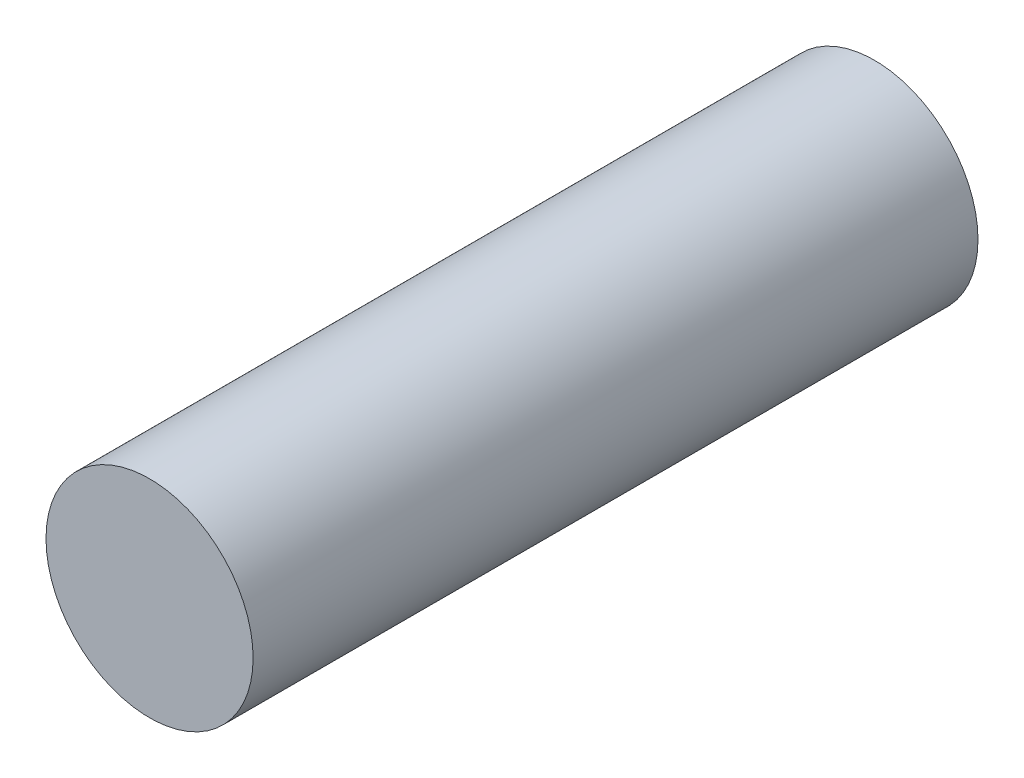
ISO-10303-21;
HEADER;
FILE_DESCRIPTION(('STEP AP214'),'2;1');
FILE_NAME('part.step','',(''),(''),'','','');
FILE_SCHEMA(('AUTOMOTIVE_DESIGN { 1 0 10303 214 1 1 1 1 }'));
ENDSEC;
DATA;
#1=APPLICATION_CONTEXT('core data for automotive mechanical design processes');
#2=APPLICATION_PROTOCOL_DEFINITION('international standard','automotive_design',2000,#1);
#3=PRODUCT_CONTEXT('',#1,'mechanical');
#4=PRODUCT('Part','Part','',(#3));
#5=PRODUCT_RELATED_PRODUCT_CATEGORY('part','',(#4));
#6=PRODUCT_DEFINITION_FORMATION('','',#4);
#7=PRODUCT_DEFINITION_CONTEXT('part definition',#1,'design');
#8=PRODUCT_DEFINITION('design','',#6,#7);
#9=PRODUCT_DEFINITION_SHAPE('','',#8);
#10=(LENGTH_UNIT() NAMED_UNIT(*) SI_UNIT(.MILLI.,.METRE.));
#11=(NAMED_UNIT(*) PLANE_ANGLE_UNIT() SI_UNIT($,.RADIAN.));
#12=(NAMED_UNIT(*) SI_UNIT($,.STERADIAN.) SOLID_ANGLE_UNIT());
#13=UNCERTAINTY_MEASURE_WITH_UNIT(LENGTH_MEASURE(1.E-05),#10,'distance_accuracy_value','');
#14=(GEOMETRIC_REPRESENTATION_CONTEXT(3) GLOBAL_UNCERTAINTY_ASSIGNED_CONTEXT((#13)) GLOBAL_UNIT_ASSIGNED_CONTEXT((#10,
#11,#12)) REPRESENTATION_CONTEXT('',''));
#15=CARTESIAN_POINT('',(0.,0.,0.));
#16=DIRECTION('',(0.,0.,1.));
#17=DIRECTION('',(1.,0.,0.));
#18=AXIS2_PLACEMENT_3D('',#15,#16,#17);
#19=CARTESIAN_POINT('',(-10.,-10.,-35.));
#20=DIRECTION('',(0.,0.,-1.));
#21=DIRECTION('',(-1.,0.,0.));
#22=AXIS2_PLACEMENT_3D('',#19,#20,#21);
#23=PLANE('',#22);
#24=CARTESIAN_POINT('',(0.,0.,-35.));
#25=DIRECTION('',(0.,0.,-1.));
#26=DIRECTION('',(-1.,0.,0.));
#27=AXIS2_PLACEMENT_3D('',#24,#25,#26);
#28=CIRCLE('',#27,5.);
#29=CARTESIAN_POINT('',(-5.,0.,-35.));
#30=VERTEX_POINT('',#29);
#31=EDGE_CURVE('E10',#30,#30,#28,.F.);
#32=ORIENTED_EDGE('',*,*,#31,.F.);
#33=EDGE_LOOP('',(#32));
#34=FACE_BOUND('',#33,.T.);
#35=ADVANCED_FACE('F35',(#34),#23,.T.);
#36=CARTESIAN_POINT('',(0.,0.,0.));
#37=DIRECTION('',(0.,0.,1.));
#38=DIRECTION('',(1.,0.,0.));
#39=AXIS2_PLACEMENT_3D('',#36,#37,#38);
#40=PLANE('',#39);
#41=CARTESIAN_POINT('',(0.,0.,0.));
#42=DIRECTION('',(0.,0.,1.));
#43=DIRECTION('',(1.,0.,0.));
#44=AXIS2_PLACEMENT_3D('',#41,#42,#43);
#45=CIRCLE('',#44,5.);
#46=CARTESIAN_POINT('',(5.,0.,0.));
#47=VERTEX_POINT('',#46);
#48=EDGE_CURVE('E41',#47,#47,#45,.T.);
#49=ORIENTED_EDGE('',*,*,#48,.T.);
#50=EDGE_LOOP('',(#49));
#51=FACE_BOUND('',#50,.T.);
#52=ADVANCED_FACE('F47',(#51),#40,.T.);
#53=CARTESIAN_POINT('',(0.,0.,-49.142135623731));
#54=DIRECTION('',(0.,0.,1.));
#55=DIRECTION('',(1.,0.,0.));
#56=AXIS2_PLACEMENT_3D('',#53,#54,#55);
#57=CYLINDRICAL_SURFACE('',#56,5.);
#58=ORIENTED_EDGE('',*,*,#48,.F.);
#59=EDGE_LOOP('',(#58));
#60=FACE_BOUND('',#59,.T.);
#61=ORIENTED_EDGE('',*,*,#31,.T.);
#62=EDGE_LOOP('',(#61));
#63=FACE_BOUND('',#62,.T.);
#64=ADVANCED_FACE('F49',(#60,#63),#57,.T.);
#65=CLOSED_SHELL('',(#35,#52,#64));
#66=MANIFOLD_SOLID_BREP('B2',#65);
#67=ADVANCED_BREP_SHAPE_REPRESENTATION('',(#18,#66),#14);
#68=SHAPE_DEFINITION_REPRESENTATION(#9,#67);
ENDSEC;
END-ISO-10303-21;
